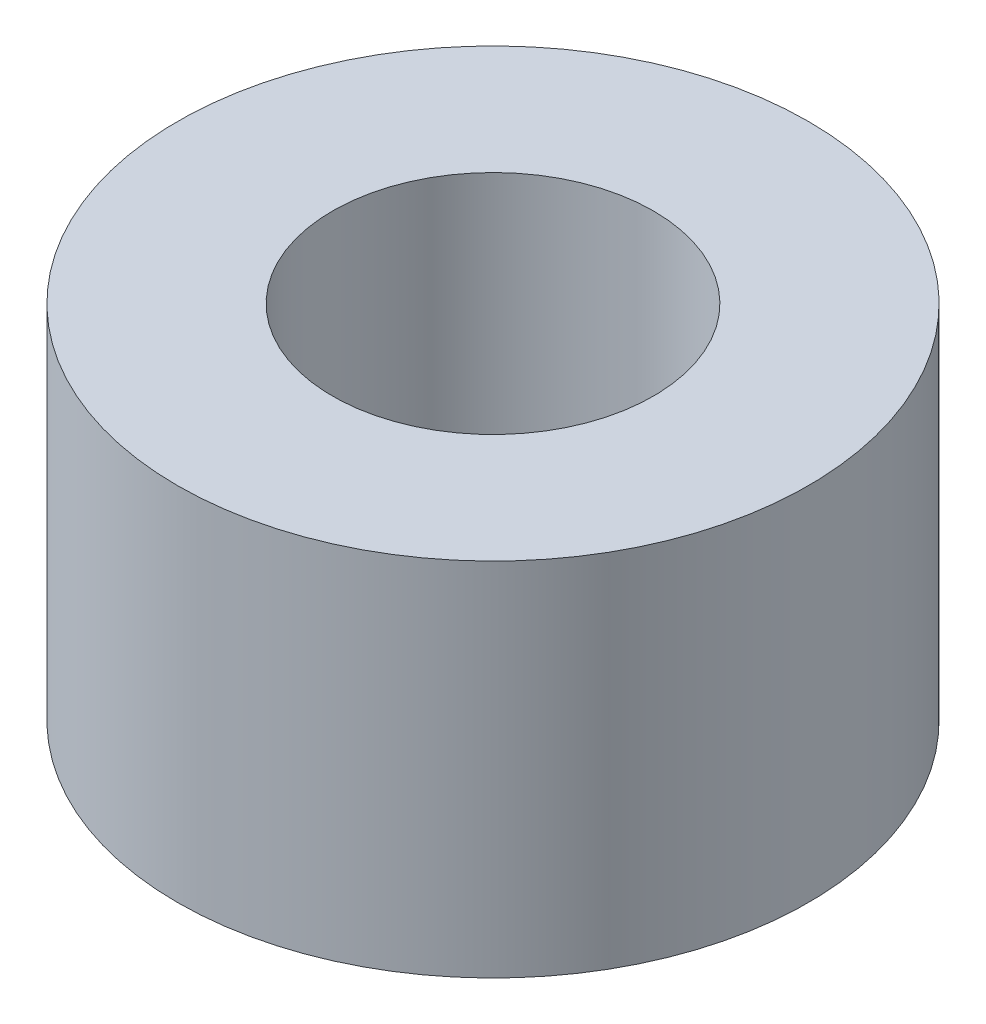
ISO-10303-21;
HEADER;
FILE_DESCRIPTION(('STEP AP214'),'2;1');
FILE_NAME('part.step','',(''),(''),'','','');
FILE_SCHEMA(('AUTOMOTIVE_DESIGN { 1 0 10303 214 1 1 1 1 }'));
ENDSEC;
DATA;
#1=APPLICATION_CONTEXT('core data for automotive mechanical design processes');
#2=APPLICATION_PROTOCOL_DEFINITION('international standard','automotive_design',2000,#1);
#3=PRODUCT_CONTEXT('',#1,'mechanical');
#4=PRODUCT('Part','Part','',(#3));
#5=PRODUCT_RELATED_PRODUCT_CATEGORY('part','',(#4));
#6=PRODUCT_DEFINITION_FORMATION('','',#4);
#7=PRODUCT_DEFINITION_CONTEXT('part definition',#1,'design');
#8=PRODUCT_DEFINITION('design','',#6,#7);
#9=PRODUCT_DEFINITION_SHAPE('','',#8);
#10=(LENGTH_UNIT() NAMED_UNIT(*) SI_UNIT(.MILLI.,.METRE.));
#11=(NAMED_UNIT(*) PLANE_ANGLE_UNIT() SI_UNIT($,.RADIAN.));
#12=(NAMED_UNIT(*) SI_UNIT($,.STERADIAN.) SOLID_ANGLE_UNIT());
#13=UNCERTAINTY_MEASURE_WITH_UNIT(LENGTH_MEASURE(1.E-05),#10,'distance_accuracy_value','');
#14=(GEOMETRIC_REPRESENTATION_CONTEXT(3) GLOBAL_UNCERTAINTY_ASSIGNED_CONTEXT((#13)) GLOBAL_UNIT_ASSIGNED_CONTEXT((#10,
#11,#12)) REPRESENTATION_CONTEXT('',''));
#15=CARTESIAN_POINT('',(0.,0.,0.));
#16=DIRECTION('',(0.,0.,1.));
#17=DIRECTION('',(1.,0.,0.));
#18=AXIS2_PLACEMENT_3D('',#15,#16,#17);
#19=CARTESIAN_POINT('',(0.,7.14502,0.));
#20=DIRECTION('',(0.,1.,0.));
#21=DIRECTION('',(0.,0.,1.));
#22=AXIS2_PLACEMENT_3D('',#19,#20,#21);
#23=PLANE('',#22);
#24=CARTESIAN_POINT('',(0.,7.14502,0.));
#25=DIRECTION('',(0.,1.,0.));
#26=DIRECTION('',(0.,0.,1.));
#27=AXIS2_PLACEMENT_3D('',#24,#25,#26);
#28=CIRCLE('',#27,6.24205);
#29=CARTESIAN_POINT('',(0.,7.14502,-6.24205));
#30=VERTEX_POINT('',#29);
#31=EDGE_CURVE('E10',#30,#30,#28,.T.);
#32=ORIENTED_EDGE('',*,*,#31,.T.);
#33=EDGE_LOOP('',(#32));
#34=FACE_BOUND('',#33,.T.);
#35=CARTESIAN_POINT('',(0.,7.14502,0.));
#36=DIRECTION('',(0.,1.,0.));
#37=DIRECTION('',(0.,0.,1.));
#38=AXIS2_PLACEMENT_3D('',#35,#36,#37);
#39=CIRCLE('',#38,3.175);
#40=CARTESIAN_POINT('',(0.,7.14502,-3.175));
#41=VERTEX_POINT('',#40);
#42=EDGE_CURVE('E43',#41,#41,#39,.T.);
#43=ORIENTED_EDGE('',*,*,#42,.F.);
#44=EDGE_LOOP('',(#43));
#45=FACE_BOUND('',#44,.T.);
#46=ADVANCED_FACE('F32',(#34,#45),#23,.T.);
#47=CARTESIAN_POINT('',(0.,0.,0.));
#48=DIRECTION('',(0.,1.,0.));
#49=DIRECTION('',(0.,0.,1.));
#50=AXIS2_PLACEMENT_3D('',#47,#48,#49);
#51=PLANE('',#50);
#52=CARTESIAN_POINT('',(0.,0.,0.));
#53=DIRECTION('',(0.,1.,0.));
#54=DIRECTION('',(0.,0.,1.));
#55=AXIS2_PLACEMENT_3D('',#52,#53,#54);
#56=CIRCLE('',#55,6.24205);
#57=CARTESIAN_POINT('',(0.,0.,-6.24205));
#58=VERTEX_POINT('',#57);
#59=EDGE_CURVE('E36',#58,#58,#56,.T.);
#60=ORIENTED_EDGE('',*,*,#59,.F.);
#61=EDGE_LOOP('',(#60));
#62=FACE_BOUND('',#61,.T.);
#63=CARTESIAN_POINT('',(0.,0.,0.));
#64=DIRECTION('',(0.,1.,0.));
#65=DIRECTION('',(0.,0.,1.));
#66=AXIS2_PLACEMENT_3D('',#63,#64,#65);
#67=CIRCLE('',#66,3.175);
#68=CARTESIAN_POINT('',(0.,0.,-3.175));
#69=VERTEX_POINT('',#68);
#70=EDGE_CURVE('E45',#69,#69,#67,.T.);
#71=ORIENTED_EDGE('',*,*,#70,.T.);
#72=EDGE_LOOP('',(#71));
#73=FACE_BOUND('',#72,.T.);
#74=ADVANCED_FACE('F55',(#62,#73),#51,.F.);
#75=CARTESIAN_POINT('',(0.,7.14502,0.));
#76=DIRECTION('',(0.,-1.,0.));
#77=DIRECTION('',(0.,0.,-1.));
#78=AXIS2_PLACEMENT_3D('',#75,#76,#77);
#79=CYLINDRICAL_SURFACE('',#78,6.24205);
#80=CARTESIAN_POINT('',(0.,7.14502,-6.24205));
#81=CARTESIAN_POINT('',(0.,7.07059270833333,-6.24205));
#82=CARTESIAN_POINT('',(0.,6.99616541666667,-6.24205));
#83=CARTESIAN_POINT('',(0.,6.84731083333333,-6.24205));
#84=CARTESIAN_POINT('',(0.,6.77288354166667,-6.24205));
#85=CARTESIAN_POINT('',(0.,6.62402895833333,-6.24205));
#86=CARTESIAN_POINT('',(0.,6.54960166666667,-6.24205));
#87=CARTESIAN_POINT('',(0.,6.40074708333333,-6.24205));
#88=CARTESIAN_POINT('',(0.,6.32631979166667,-6.24205));
#89=CARTESIAN_POINT('',(0.,6.17746520833333,-6.24205));
#90=CARTESIAN_POINT('',(0.,6.10303791666667,-6.24205));
#91=CARTESIAN_POINT('',(0.,5.95418333333333,-6.24205));
#92=CARTESIAN_POINT('',(0.,5.87975604166667,-6.24205));
#93=CARTESIAN_POINT('',(0.,5.73090145833333,-6.24205));
#94=CARTESIAN_POINT('',(0.,5.65647416666667,-6.24205));
#95=CARTESIAN_POINT('',(0.,5.50761958333333,-6.24205));
#96=CARTESIAN_POINT('',(0.,5.43319229166667,-6.24205));
#97=CARTESIAN_POINT('',(0.,5.28433770833333,-6.24205));
#98=CARTESIAN_POINT('',(0.,5.20991041666667,-6.24205));
#99=CARTESIAN_POINT('',(0.,5.06105583333333,-6.24205));
#100=CARTESIAN_POINT('',(0.,4.98662854166667,-6.24205));
#101=CARTESIAN_POINT('',(0.,4.83777395833333,-6.24205));
#102=CARTESIAN_POINT('',(0.,4.76334666666667,-6.24205));
#103=CARTESIAN_POINT('',(0.,4.61449208333333,-6.24205));
#104=CARTESIAN_POINT('',(0.,4.54006479166667,-6.24205));
#105=CARTESIAN_POINT('',(0.,4.39121020833333,-6.24205));
#106=CARTESIAN_POINT('',(0.,4.31678291666667,-6.24205));
#107=CARTESIAN_POINT('',(0.,4.16792833333333,-6.24205));
#108=CARTESIAN_POINT('',(0.,4.09350104166667,-6.24205));
#109=CARTESIAN_POINT('',(0.,3.94464645833333,-6.24205));
#110=CARTESIAN_POINT('',(0.,3.87021916666667,-6.24205));
#111=CARTESIAN_POINT('',(0.,3.72136458333333,-6.24205));
#112=CARTESIAN_POINT('',(0.,3.64693729166667,-6.24205));
#113=CARTESIAN_POINT('',(0.,3.49808270833333,-6.24205));
#114=CARTESIAN_POINT('',(0.,3.42365541666667,-6.24205));
#115=CARTESIAN_POINT('',(0.,3.27480083333333,-6.24205));
#116=CARTESIAN_POINT('',(0.,3.20037354166667,-6.24205));
#117=CARTESIAN_POINT('',(0.,3.05151895833333,-6.24205));
#118=CARTESIAN_POINT('',(0.,2.97709166666667,-6.24205));
#119=CARTESIAN_POINT('',(0.,2.82823708333333,-6.24205));
#120=CARTESIAN_POINT('',(0.,2.75380979166667,-6.24205));
#121=CARTESIAN_POINT('',(0.,2.60495520833333,-6.24205));
#122=CARTESIAN_POINT('',(0.,2.53052791666667,-6.24205));
#123=CARTESIAN_POINT('',(0.,2.38167333333333,-6.24205));
#124=CARTESIAN_POINT('',(0.,2.30724604166667,-6.24205));
#125=CARTESIAN_POINT('',(0.,2.15839145833333,-6.24205));
#126=CARTESIAN_POINT('',(0.,2.08396416666667,-6.24205));
#127=CARTESIAN_POINT('',(0.,1.93510958333333,-6.24205));
#128=CARTESIAN_POINT('',(0.,1.86068229166667,-6.24205));
#129=CARTESIAN_POINT('',(0.,1.71182770833333,-6.24205));
#130=CARTESIAN_POINT('',(0.,1.63740041666667,-6.24205));
#131=CARTESIAN_POINT('',(0.,1.48854583333333,-6.24205));
#132=CARTESIAN_POINT('',(0.,1.41411854166667,-6.24205));
#133=CARTESIAN_POINT('',(0.,1.26526395833333,-6.24205));
#134=CARTESIAN_POINT('',(0.,1.19083666666667,-6.24205));
#135=CARTESIAN_POINT('',(0.,1.04198208333333,-6.24205));
#136=CARTESIAN_POINT('',(0.,0.967554791666667,-6.24205));
#137=CARTESIAN_POINT('',(0.,0.818700208333334,-6.24205));
#138=CARTESIAN_POINT('',(0.,0.744272916666667,-6.24205));
#139=CARTESIAN_POINT('',(0.,0.595418333333333,-6.24205));
#140=CARTESIAN_POINT('',(0.,0.520991041666667,-6.24205));
#141=CARTESIAN_POINT('',(0.,0.372136458333333,-6.24205));
#142=CARTESIAN_POINT('',(0.,0.297709166666667,-6.24205));
#143=CARTESIAN_POINT('',(0.,0.148854583333333,-6.24205));
#144=CARTESIAN_POINT('',(0.,0.0744272916666668,-6.24205));
#145=CARTESIAN_POINT('',(0.,0.,-6.24205));
#146=B_SPLINE_CURVE_WITH_KNOTS('',3,(#80,#81,#82,#83,#84,#85,#86,#87,#88,#89,#90,#91,#92,#93,
#94,#95,#96,#97,#98,#99,#100,#101,#102,#103,#104,#105,#106,#107,#108,#109,#110,#111,#112,#113,
#114,#115,#116,#117,#118,#119,#120,#121,#122,#123,#124,#125,#126,#127,#128,#129,#130,#131,#132,
#133,#134,#135,#136,#137,#138,#139,#140,#141,#142,#143,#144,#145),.UNSPECIFIED.,.F.,.F.,(4,2,2,
2,2,2,2,2,2,2,2,2,2,2,2,2,2,2,2,2,2,2,2,2,2,2,2,2,2,2,2,2,4),(0.,0.223281875,0.44656375,
0.669845625,0.8931275,1.116409375,1.33969125,1.562973125,1.786255,2.009536875,2.23281875,
2.456100625,2.6793825,2.902664375,3.12594625,3.349228125,3.57251,3.795791875,4.01907375,
4.242355625,4.4656375,4.688919375,4.91220125,5.135483125,5.358765,5.582046875,5.80532875,
6.028610625,6.2518925,6.475174375,6.69845625,6.921738125,7.14502),.UNSPECIFIED.);
#147=EDGE_CURVE('BSEAM34',#30,#58,#146,.T.);
#148=ORIENTED_EDGE('',*,*,#31,.F.);
#149=ORIENTED_EDGE('',*,*,#59,.T.);
#150=ORIENTED_EDGE('',*,*,#147,.T.);
#151=ORIENTED_EDGE('',*,*,#147,.F.);
#152=EDGE_LOOP('',(#148,#150,#149,#151));
#153=FACE_BOUND('',#152,.T.);
#154=ADVANCED_FACE('F34',(#153),#79,.T.);
#155=CARTESIAN_POINT('',(0.,7.14502,0.));
#156=DIRECTION('',(0.,-1.,0.));
#157=DIRECTION('',(0.,0.,-1.));
#158=AXIS2_PLACEMENT_3D('',#155,#156,#157);
#159=CYLINDRICAL_SURFACE('',#158,3.175);
#160=CARTESIAN_POINT('',(0.,7.14502,-3.175));
#161=CARTESIAN_POINT('',(0.,7.07059270833333,-3.175));
#162=CARTESIAN_POINT('',(0.,6.99616541666667,-3.175));
#163=CARTESIAN_POINT('',(0.,6.84731083333333,-3.175));
#164=CARTESIAN_POINT('',(0.,6.77288354166667,-3.175));
#165=CARTESIAN_POINT('',(0.,6.62402895833333,-3.175));
#166=CARTESIAN_POINT('',(0.,6.54960166666667,-3.175));
#167=CARTESIAN_POINT('',(0.,6.40074708333333,-3.175));
#168=CARTESIAN_POINT('',(0.,6.32631979166667,-3.175));
#169=CARTESIAN_POINT('',(0.,6.17746520833333,-3.175));
#170=CARTESIAN_POINT('',(0.,6.10303791666667,-3.175));
#171=CARTESIAN_POINT('',(0.,5.95418333333333,-3.175));
#172=CARTESIAN_POINT('',(0.,5.87975604166667,-3.175));
#173=CARTESIAN_POINT('',(0.,5.73090145833333,-3.175));
#174=CARTESIAN_POINT('',(0.,5.65647416666667,-3.175));
#175=CARTESIAN_POINT('',(0.,5.50761958333333,-3.175));
#176=CARTESIAN_POINT('',(0.,5.43319229166667,-3.175));
#177=CARTESIAN_POINT('',(0.,5.28433770833333,-3.175));
#178=CARTESIAN_POINT('',(0.,5.20991041666667,-3.175));
#179=CARTESIAN_POINT('',(0.,5.06105583333333,-3.175));
#180=CARTESIAN_POINT('',(0.,4.98662854166667,-3.175));
#181=CARTESIAN_POINT('',(0.,4.83777395833333,-3.175));
#182=CARTESIAN_POINT('',(0.,4.76334666666667,-3.175));
#183=CARTESIAN_POINT('',(0.,4.61449208333333,-3.175));
#184=CARTESIAN_POINT('',(0.,4.54006479166667,-3.175));
#185=CARTESIAN_POINT('',(0.,4.39121020833333,-3.175));
#186=CARTESIAN_POINT('',(0.,4.31678291666667,-3.175));
#187=CARTESIAN_POINT('',(0.,4.16792833333333,-3.175));
#188=CARTESIAN_POINT('',(0.,4.09350104166667,-3.175));
#189=CARTESIAN_POINT('',(0.,3.94464645833333,-3.175));
#190=CARTESIAN_POINT('',(0.,3.87021916666667,-3.175));
#191=CARTESIAN_POINT('',(0.,3.72136458333333,-3.175));
#192=CARTESIAN_POINT('',(0.,3.64693729166667,-3.175));
#193=CARTESIAN_POINT('',(0.,3.49808270833333,-3.175));
#194=CARTESIAN_POINT('',(0.,3.42365541666667,-3.175));
#195=CARTESIAN_POINT('',(0.,3.27480083333333,-3.175));
#196=CARTESIAN_POINT('',(0.,3.20037354166667,-3.175));
#197=CARTESIAN_POINT('',(0.,3.05151895833333,-3.175));
#198=CARTESIAN_POINT('',(0.,2.97709166666667,-3.175));
#199=CARTESIAN_POINT('',(0.,2.82823708333333,-3.175));
#200=CARTESIAN_POINT('',(0.,2.75380979166667,-3.175));
#201=CARTESIAN_POINT('',(0.,2.60495520833333,-3.175));
#202=CARTESIAN_POINT('',(0.,2.53052791666667,-3.175));
#203=CARTESIAN_POINT('',(0.,2.38167333333333,-3.175));
#204=CARTESIAN_POINT('',(0.,2.30724604166667,-3.175));
#205=CARTESIAN_POINT('',(0.,2.15839145833333,-3.175));
#206=CARTESIAN_POINT('',(0.,2.08396416666667,-3.175));
#207=CARTESIAN_POINT('',(0.,1.93510958333333,-3.175));
#208=CARTESIAN_POINT('',(0.,1.86068229166667,-3.175));
#209=CARTESIAN_POINT('',(0.,1.71182770833333,-3.175));
#210=CARTESIAN_POINT('',(0.,1.63740041666667,-3.175));
#211=CARTESIAN_POINT('',(0.,1.48854583333333,-3.175));
#212=CARTESIAN_POINT('',(0.,1.41411854166667,-3.175));
#213=CARTESIAN_POINT('',(0.,1.26526395833333,-3.175));
#214=CARTESIAN_POINT('',(0.,1.19083666666667,-3.175));
#215=CARTESIAN_POINT('',(0.,1.04198208333333,-3.175));
#216=CARTESIAN_POINT('',(0.,0.967554791666667,-3.175));
#217=CARTESIAN_POINT('',(0.,0.818700208333334,-3.175));
#218=CARTESIAN_POINT('',(0.,0.744272916666667,-3.175));
#219=CARTESIAN_POINT('',(0.,0.595418333333333,-3.175));
#220=CARTESIAN_POINT('',(0.,0.520991041666667,-3.175));
#221=CARTESIAN_POINT('',(0.,0.372136458333333,-3.175));
#222=CARTESIAN_POINT('',(0.,0.297709166666667,-3.175));
#223=CARTESIAN_POINT('',(0.,0.148854583333333,-3.175));
#224=CARTESIAN_POINT('',(0.,0.0744272916666668,-3.175));
#225=CARTESIAN_POINT('',(0.,0.,-3.175));
#226=B_SPLINE_CURVE_WITH_KNOTS('',3,(#160,#161,#162,#163,#164,#165,#166,#167,#168,#169,#170,
#171,#172,#173,#174,#175,#176,#177,#178,#179,#180,#181,#182,#183,#184,#185,#186,#187,#188,#189,
#190,#191,#192,#193,#194,#195,#196,#197,#198,#199,#200,#201,#202,#203,#204,#205,#206,#207,#208,
#209,#210,#211,#212,#213,#214,#215,#216,#217,#218,#219,#220,#221,#222,#223,#224,#225),
.UNSPECIFIED.,.F.,.F.,(4,2,2,2,2,2,2,2,2,2,2,2,2,2,2,2,2,2,2,2,2,2,2,2,2,2,2,2,2,2,2,2,4),(0.,
0.223281874999999,0.446563749999999,0.669845624999999,0.893127499999999,1.116409375,1.33969125,
1.562973125,1.786255,2.009536875,2.23281875,2.456100625,2.6793825,2.902664375,3.12594625,
3.349228125,3.57251,3.795791875,4.01907375,4.242355625,4.4656375,4.688919375,4.91220125,
5.135483125,5.358765,5.582046875,5.80532875,6.028610625,6.2518925,6.475174375,6.69845625,
6.921738125,7.14502),.UNSPECIFIED.);
#227=EDGE_CURVE('BSEAM51',#41,#69,#226,.T.);
#228=ORIENTED_EDGE('',*,*,#42,.T.);
#229=ORIENTED_EDGE('',*,*,#70,.F.);
#230=ORIENTED_EDGE('',*,*,#227,.T.);
#231=ORIENTED_EDGE('',*,*,#227,.F.);
#232=EDGE_LOOP('',(#228,#230,#229,#231));
#233=FACE_BOUND('',#232,.T.);
#234=ADVANCED_FACE('F51',(#233),#159,.F.);
#235=CLOSED_SHELL('',(#46,#74,#154,#234));
#236=MANIFOLD_SOLID_BREP('B2',#235);
#237=ADVANCED_BREP_SHAPE_REPRESENTATION('',(#18,#236),#14);
#238=SHAPE_DEFINITION_REPRESENTATION(#9,#237);
ENDSEC;
END-ISO-10303-21;
